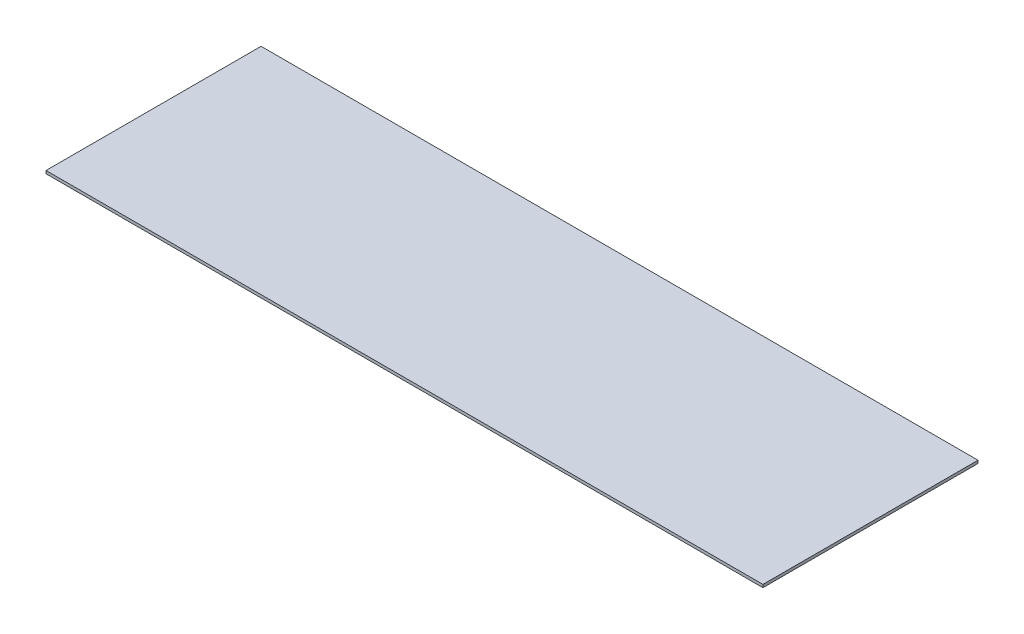
ISO-10303-21;
HEADER;
FILE_DESCRIPTION(('STEP AP214'),'2;1');
FILE_NAME('part.step','',(''),(''),'','','');
FILE_SCHEMA(('AUTOMOTIVE_DESIGN { 1 0 10303 214 1 1 1 1 }'));
ENDSEC;
DATA;
#1=APPLICATION_CONTEXT('core data for automotive mechanical design processes');
#2=APPLICATION_PROTOCOL_DEFINITION('international standard','automotive_design',2000,#1);
#3=PRODUCT_CONTEXT('',#1,'mechanical');
#4=PRODUCT('Part','Part','',(#3));
#5=PRODUCT_RELATED_PRODUCT_CATEGORY('part','',(#4));
#6=PRODUCT_DEFINITION_FORMATION('','',#4);
#7=PRODUCT_DEFINITION_CONTEXT('part definition',#1,'design');
#8=PRODUCT_DEFINITION('design','',#6,#7);
#9=PRODUCT_DEFINITION_SHAPE('','',#8);
#10=(LENGTH_UNIT() NAMED_UNIT(*) SI_UNIT(.MILLI.,.METRE.));
#11=(NAMED_UNIT(*) PLANE_ANGLE_UNIT() SI_UNIT($,.RADIAN.));
#12=(NAMED_UNIT(*) SI_UNIT($,.STERADIAN.) SOLID_ANGLE_UNIT());
#13=UNCERTAINTY_MEASURE_WITH_UNIT(LENGTH_MEASURE(1.E-05),#10,'distance_accuracy_value','');
#14=(GEOMETRIC_REPRESENTATION_CONTEXT(3) GLOBAL_UNCERTAINTY_ASSIGNED_CONTEXT((#13)) GLOBAL_UNIT_ASSIGNED_CONTEXT((#10,
#11,#12)) REPRESENTATION_CONTEXT('',''));
#15=CARTESIAN_POINT('',(0.,0.,0.));
#16=DIRECTION('',(0.,0.,1.));
#17=DIRECTION('',(1.,0.,0.));
#18=AXIS2_PLACEMENT_3D('',#15,#16,#17);
#19=CARTESIAN_POINT('',(-500.,4.00000000000009,300.));
#20=DIRECTION('',(1.,0.,0.));
#21=DIRECTION('',(0.,0.,-1.));
#22=AXIS2_PLACEMENT_3D('',#19,#20,#21);
#23=PLANE('',#22);
#24=DIRECTION('',(0.,-1.,0.));
#25=VECTOR('',#24,1.);
#26=CARTESIAN_POINT('',(-500.,4.00000000000009,0.));
#27=LINE('',#26,#25);
#28=CARTESIAN_POINT('',(-500.,4.00000000000009,0.));
#29=VERTEX_POINT('',#28);
#30=CARTESIAN_POINT('',(-500.,0.,0.));
#31=VERTEX_POINT('',#30);
#32=EDGE_CURVE('E98',#29,#31,#27,.T.);
#33=ORIENTED_EDGE('',*,*,#32,.T.);
#34=DIRECTION('',(0.,0.,-1.));
#35=VECTOR('',#34,1.);
#36=CARTESIAN_POINT('',(-500.,0.,300.));
#37=LINE('',#36,#35);
#38=CARTESIAN_POINT('',(-500.,0.,300.));
#39=VERTEX_POINT('',#38);
#40=EDGE_CURVE('E11',#39,#31,#37,.T.);
#41=ORIENTED_EDGE('',*,*,#40,.F.);
#42=DIRECTION('',(0.,-1.,0.));
#43=VECTOR('',#42,1.);
#44=CARTESIAN_POINT('',(-500.,4.00000000000009,300.));
#45=LINE('',#44,#43);
#46=CARTESIAN_POINT('',(-500.,4.00000000000009,300.));
#47=VERTEX_POINT('',#46);
#48=EDGE_CURVE('E86',#47,#39,#45,.T.);
#49=ORIENTED_EDGE('',*,*,#48,.F.);
#50=DIRECTION('',(0.,0.,-1.));
#51=VECTOR('',#50,1.);
#52=CARTESIAN_POINT('',(-500.,4.00000000000009,300.));
#53=LINE('',#52,#51);
#54=EDGE_CURVE('E94',#47,#29,#53,.T.);
#55=ORIENTED_EDGE('',*,*,#54,.T.);
#56=EDGE_LOOP('',(#33,#41,#49,#55));
#57=FACE_BOUND('',#56,.T.);
#58=ADVANCED_FACE('F35',(#57),#23,.F.);
#59=CARTESIAN_POINT('',(500.,2.11763038754724E-13,300.));
#60=DIRECTION('',(0.,1.,0.));
#61=DIRECTION('',(-1.,0.,0.));
#62=AXIS2_PLACEMENT_3D('',#59,#60,#61);
#63=PLANE('',#62);
#64=DIRECTION('',(1.,0.,0.));
#65=VECTOR('',#64,1.);
#66=CARTESIAN_POINT('',(500.,2.11763038754724E-13,0.));
#67=LINE('',#66,#65);
#68=CARTESIAN_POINT('',(500.,2.11763038754724E-13,0.));
#69=VERTEX_POINT('',#68);
#70=EDGE_CURVE('E90',#31,#69,#67,.T.);
#71=ORIENTED_EDGE('',*,*,#70,.T.);
#72=DIRECTION('',(0.,0.,-1.));
#73=VECTOR('',#72,1.);
#74=CARTESIAN_POINT('',(500.,2.11763038754724E-13,300.));
#75=LINE('',#74,#73);
#76=CARTESIAN_POINT('',(500.,2.11763038754724E-13,300.));
#77=VERTEX_POINT('',#76);
#78=EDGE_CURVE('E43',#77,#69,#75,.T.);
#79=ORIENTED_EDGE('',*,*,#78,.F.);
#80=DIRECTION('',(1.,0.,0.));
#81=VECTOR('',#80,1.);
#82=CARTESIAN_POINT('',(500.,2.11763038754724E-13,300.));
#83=LINE('',#82,#81);
#84=EDGE_CURVE('E81',#39,#77,#83,.T.);
#85=ORIENTED_EDGE('',*,*,#84,.F.);
#86=ORIENTED_EDGE('',*,*,#40,.T.);
#87=EDGE_LOOP('',(#71,#79,#85,#86));
#88=FACE_BOUND('',#87,.T.);
#89=ADVANCED_FACE('F89',(#88),#63,.F.);
#90=CARTESIAN_POINT('',(500.,2.11763038754724E-13,300.));
#91=DIRECTION('',(-1.,0.,0.));
#92=DIRECTION('',(0.,0.,1.));
#93=AXIS2_PLACEMENT_3D('',#90,#91,#92);
#94=PLANE('',#93);
#95=DIRECTION('',(0.,1.,0.));
#96=VECTOR('',#95,1.);
#97=CARTESIAN_POINT('',(500.,2.11763038754724E-13,0.));
#98=LINE('',#97,#96);
#99=CARTESIAN_POINT('',(500.,4.00000000000021,0.));
#100=VERTEX_POINT('',#99);
#101=EDGE_CURVE('E68',#69,#100,#98,.T.);
#102=ORIENTED_EDGE('',*,*,#101,.T.);
#103=DIRECTION('',(0.,0.,-1.));
#104=VECTOR('',#103,1.);
#105=CARTESIAN_POINT('',(500.,4.00000000000021,300.));
#106=LINE('',#105,#104);
#107=CARTESIAN_POINT('',(500.,4.00000000000021,300.));
#108=VERTEX_POINT('',#107);
#109=EDGE_CURVE('E91',#108,#100,#106,.T.);
#110=ORIENTED_EDGE('',*,*,#109,.F.);
#111=DIRECTION('',(0.,1.,0.));
#112=VECTOR('',#111,1.);
#113=CARTESIAN_POINT('',(500.,2.11763038754724E-13,300.));
#114=LINE('',#113,#112);
#115=EDGE_CURVE('E84',#77,#108,#114,.T.);
#116=ORIENTED_EDGE('',*,*,#115,.F.);
#117=ORIENTED_EDGE('',*,*,#78,.T.);
#118=EDGE_LOOP('',(#102,#110,#116,#117));
#119=FACE_BOUND('',#118,.T.);
#120=ADVANCED_FACE('F92',(#119),#94,.F.);
#121=CARTESIAN_POINT('',(500.,4.00000000000021,300.));
#122=DIRECTION('',(0.,-1.,0.));
#123=DIRECTION('',(1.,0.,0.));
#124=AXIS2_PLACEMENT_3D('',#121,#122,#123);
#125=PLANE('',#124);
#126=DIRECTION('',(-1.,0.,0.));
#127=VECTOR('',#126,1.);
#128=CARTESIAN_POINT('',(500.,4.00000000000021,0.));
#129=LINE('',#128,#127);
#130=EDGE_CURVE('E74',#100,#29,#129,.T.);
#131=ORIENTED_EDGE('',*,*,#130,.T.);
#132=ORIENTED_EDGE('',*,*,#54,.F.);
#133=DIRECTION('',(-1.,0.,0.));
#134=VECTOR('',#133,1.);
#135=CARTESIAN_POINT('',(500.,4.00000000000021,300.));
#136=LINE('',#135,#134);
#137=EDGE_CURVE('E51',#108,#47,#136,.T.);
#138=ORIENTED_EDGE('',*,*,#137,.F.);
#139=ORIENTED_EDGE('',*,*,#109,.T.);
#140=EDGE_LOOP('',(#131,#132,#138,#139));
#141=FACE_BOUND('',#140,.T.);
#142=ADVANCED_FACE('F105',(#141),#125,.F.);
#143=CARTESIAN_POINT('',(0.,0.,300.));
#144=DIRECTION('',(0.,0.,-1.));
#145=DIRECTION('',(-1.,0.,0.));
#146=AXIS2_PLACEMENT_3D('',#143,#144,#145);
#147=PLANE('',#146);
#148=ORIENTED_EDGE('',*,*,#48,.T.);
#149=ORIENTED_EDGE('',*,*,#84,.T.);
#150=ORIENTED_EDGE('',*,*,#115,.T.);
#151=ORIENTED_EDGE('',*,*,#137,.T.);
#152=EDGE_LOOP('',(#148,#149,#150,#151));
#153=FACE_BOUND('',#152,.T.);
#154=ADVANCED_FACE('F82',(#153),#147,.F.);
#155=CARTESIAN_POINT('',(0.,0.,0.));
#156=DIRECTION('',(0.,0.,-1.));
#157=DIRECTION('',(-1.,0.,0.));
#158=AXIS2_PLACEMENT_3D('',#155,#156,#157);
#159=PLANE('',#158);
#160=ORIENTED_EDGE('',*,*,#32,.F.);
#161=ORIENTED_EDGE('',*,*,#130,.F.);
#162=ORIENTED_EDGE('',*,*,#101,.F.);
#163=ORIENTED_EDGE('',*,*,#70,.F.);
#164=EDGE_LOOP('',(#160,#161,#162,#163));
#165=FACE_BOUND('',#164,.T.);
#166=ADVANCED_FACE('F108',(#165),#159,.T.);
#167=CLOSED_SHELL('',(#58,#89,#120,#142,#154,#166));
#168=MANIFOLD_SOLID_BREP('B2',#167);
#169=ADVANCED_BREP_SHAPE_REPRESENTATION('',(#18,#168),#14);
#170=SHAPE_DEFINITION_REPRESENTATION(#9,#169);
ENDSEC;
END-ISO-10303-21;
